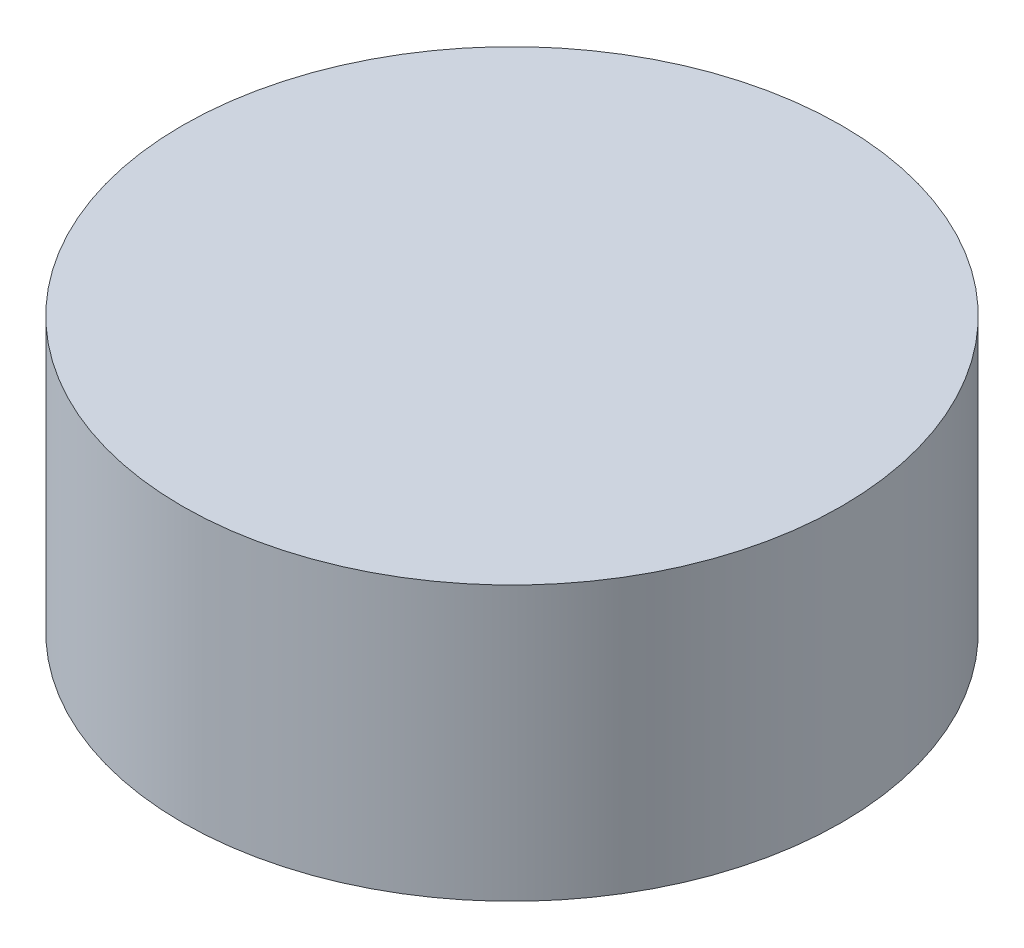
ISO-10303-21;
HEADER;
FILE_DESCRIPTION(('STEP AP214'),'2;1');
FILE_NAME('part.step','',(''),(''),'','','');
FILE_SCHEMA(('AUTOMOTIVE_DESIGN { 1 0 10303 214 1 1 1 1 }'));
ENDSEC;
DATA;
#1=APPLICATION_CONTEXT('core data for automotive mechanical design processes');
#2=APPLICATION_PROTOCOL_DEFINITION('international standard','automotive_design',2000,#1);
#3=PRODUCT_CONTEXT('',#1,'mechanical');
#4=PRODUCT('Part','Part','',(#3));
#5=PRODUCT_RELATED_PRODUCT_CATEGORY('part','',(#4));
#6=PRODUCT_DEFINITION_FORMATION('','',#4);
#7=PRODUCT_DEFINITION_CONTEXT('part definition',#1,'design');
#8=PRODUCT_DEFINITION('design','',#6,#7);
#9=PRODUCT_DEFINITION_SHAPE('','',#8);
#10=(LENGTH_UNIT() NAMED_UNIT(*) SI_UNIT(.MILLI.,.METRE.));
#11=(NAMED_UNIT(*) PLANE_ANGLE_UNIT() SI_UNIT($,.RADIAN.));
#12=(NAMED_UNIT(*) SI_UNIT($,.STERADIAN.) SOLID_ANGLE_UNIT());
#13=UNCERTAINTY_MEASURE_WITH_UNIT(LENGTH_MEASURE(1.E-05),#10,'distance_accuracy_value','');
#14=(GEOMETRIC_REPRESENTATION_CONTEXT(3) GLOBAL_UNCERTAINTY_ASSIGNED_CONTEXT((#13)) GLOBAL_UNIT_ASSIGNED_CONTEXT((#10,
#11,#12)) REPRESENTATION_CONTEXT('',''));
#15=CARTESIAN_POINT('',(0.,0.,0.));
#16=DIRECTION('',(0.,0.,1.));
#17=DIRECTION('',(1.,0.,0.));
#18=AXIS2_PLACEMENT_3D('',#15,#16,#17);
#19=CARTESIAN_POINT('',(0.,27.,0.));
#20=DIRECTION('',(0.,-1.,0.));
#21=DIRECTION('',(0.,0.,-1.));
#22=AXIS2_PLACEMENT_3D('',#19,#20,#21);
#23=CYLINDRICAL_SURFACE('',#22,32.5);
#24=CARTESIAN_POINT('',(0.,27.,0.));
#25=DIRECTION('',(0.,1.,0.));
#26=DIRECTION('',(0.,0.,1.));
#27=AXIS2_PLACEMENT_3D('',#24,#25,#26);
#28=CIRCLE('',#27,32.5);
#29=CARTESIAN_POINT('',(0.,27.,32.5));
#30=VERTEX_POINT('',#29);
#31=EDGE_CURVE('E10',#30,#30,#28,.T.);
#32=ORIENTED_EDGE('',*,*,#31,.F.);
#33=EDGE_LOOP('',(#32));
#34=FACE_BOUND('',#33,.T.);
#35=CARTESIAN_POINT('',(0.,0.,0.));
#36=DIRECTION('',(0.,1.,0.));
#37=DIRECTION('',(0.,0.,1.));
#38=AXIS2_PLACEMENT_3D('',#35,#36,#37);
#39=CIRCLE('',#38,32.5);
#40=CARTESIAN_POINT('',(0.,0.,32.5));
#41=VERTEX_POINT('',#40);
#42=EDGE_CURVE('E36',#41,#41,#39,.T.);
#43=ORIENTED_EDGE('',*,*,#42,.T.);
#44=EDGE_LOOP('',(#43));
#45=FACE_BOUND('',#44,.T.);
#46=ADVANCED_FACE('F33',(#34,#45),#23,.T.);
#47=CARTESIAN_POINT('',(0.,27.,0.));
#48=DIRECTION('',(0.,1.,0.));
#49=DIRECTION('',(0.,0.,1.));
#50=AXIS2_PLACEMENT_3D('',#47,#48,#49);
#51=PLANE('',#50);
#52=ORIENTED_EDGE('',*,*,#31,.T.);
#53=EDGE_LOOP('',(#52));
#54=FACE_BOUND('',#53,.T.);
#55=ADVANCED_FACE('F48',(#54),#51,.T.);
#56=CARTESIAN_POINT('',(0.,0.,0.));
#57=DIRECTION('',(0.,1.,0.));
#58=DIRECTION('',(0.,0.,1.));
#59=AXIS2_PLACEMENT_3D('',#56,#57,#58);
#60=PLANE('',#59);
#61=ORIENTED_EDGE('',*,*,#42,.F.);
#62=EDGE_LOOP('',(#61));
#63=FACE_BOUND('',#62,.T.);
#64=ADVANCED_FACE('F46',(#63),#60,.F.);
#65=CLOSED_SHELL('',(#46,#55,#64));
#66=MANIFOLD_SOLID_BREP('B2',#65);
#67=ADVANCED_BREP_SHAPE_REPRESENTATION('',(#18,#66),#14);
#68=SHAPE_DEFINITION_REPRESENTATION(#9,#67);
ENDSEC;
END-ISO-10303-21;
